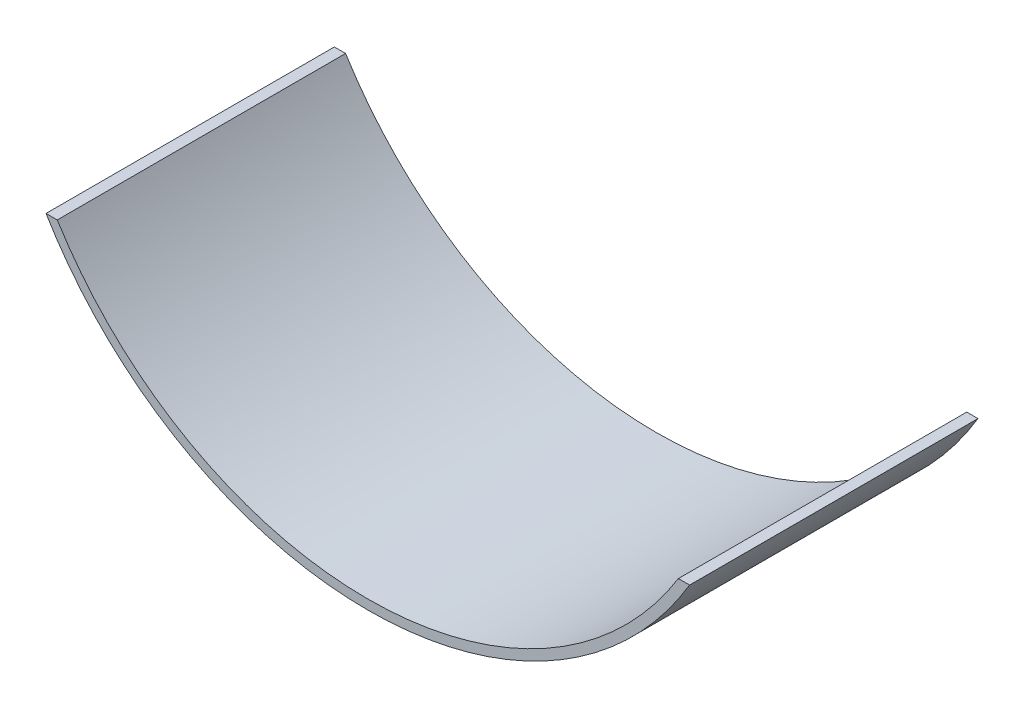
ISO-10303-21;
HEADER;
FILE_DESCRIPTION(('STEP AP214'),'2;1');
FILE_NAME('part.step','',(''),(''),'','','');
FILE_SCHEMA(('AUTOMOTIVE_DESIGN { 1 0 10303 214 1 1 1 1 }'));
ENDSEC;
DATA;
#1=APPLICATION_CONTEXT('core data for automotive mechanical design processes');
#2=APPLICATION_PROTOCOL_DEFINITION('international standard','automotive_design',2000,#1);
#3=PRODUCT_CONTEXT('',#1,'mechanical');
#4=PRODUCT('Part','Part','',(#3));
#5=PRODUCT_RELATED_PRODUCT_CATEGORY('part','',(#4));
#6=PRODUCT_DEFINITION_FORMATION('','',#4);
#7=PRODUCT_DEFINITION_CONTEXT('part definition',#1,'design');
#8=PRODUCT_DEFINITION('design','',#6,#7);
#9=PRODUCT_DEFINITION_SHAPE('','',#8);
#10=(LENGTH_UNIT() NAMED_UNIT(*) SI_UNIT(.MILLI.,.METRE.));
#11=(NAMED_UNIT(*) PLANE_ANGLE_UNIT() SI_UNIT($,.RADIAN.));
#12=(NAMED_UNIT(*) SI_UNIT($,.STERADIAN.) SOLID_ANGLE_UNIT());
#13=UNCERTAINTY_MEASURE_WITH_UNIT(LENGTH_MEASURE(1.E-05),#10,'distance_accuracy_value','');
#14=(GEOMETRIC_REPRESENTATION_CONTEXT(3) GLOBAL_UNCERTAINTY_ASSIGNED_CONTEXT((#13)) GLOBAL_UNIT_ASSIGNED_CONTEXT((#10,
#11,#12)) REPRESENTATION_CONTEXT('',''));
#15=CARTESIAN_POINT('',(0.,0.,0.));
#16=DIRECTION('',(0.,0.,1.));
#17=DIRECTION('',(1.,0.,0.));
#18=AXIS2_PLACEMENT_3D('',#15,#16,#17);
#19=CARTESIAN_POINT('',(0.,-100.,150.));
#20=DIRECTION('',(0.,1.,0.));
#21=DIRECTION('',(0.,0.,1.));
#22=AXIS2_PLACEMENT_3D('',#19,#20,#21);
#23=PLANE('',#22);
#24=DIRECTION('',(-1.,0.,0.));
#25=VECTOR('',#24,1.);
#26=CARTESIAN_POINT('',(167.406690427832,-100.,150.));
#27=LINE('',#26,#25);
#28=CARTESIAN_POINT('',(167.406690427832,-100.,150.));
#29=VERTEX_POINT('',#28);
#30=CARTESIAN_POINT('',(161.554944214035,-100.,150.));
#31=VERTEX_POINT('',#30);
#32=EDGE_CURVE('E83',#29,#31,#27,.T.);
#33=ORIENTED_EDGE('',*,*,#32,.F.);
#34=DIRECTION('',(0.,0.,-1.));
#35=VECTOR('',#34,1.);
#36=CARTESIAN_POINT('',(167.406690427832,-100.,150.));
#37=LINE('',#36,#35);
#38=CARTESIAN_POINT('',(167.406690427832,-100.,0.));
#39=VERTEX_POINT('',#38);
#40=EDGE_CURVE('E92',#29,#39,#37,.T.);
#41=ORIENTED_EDGE('',*,*,#40,.T.);
#42=DIRECTION('',(1.,0.,0.));
#43=VECTOR('',#42,1.);
#44=CARTESIAN_POINT('',(167.406690427832,-100.,0.));
#45=LINE('',#44,#43);
#46=CARTESIAN_POINT('',(161.554944214035,-100.,0.));
#47=VERTEX_POINT('',#46);
#48=EDGE_CURVE('E89',#47,#39,#45,.T.);
#49=ORIENTED_EDGE('',*,*,#48,.F.);
#50=DIRECTION('',(0.,0.,-1.));
#51=VECTOR('',#50,1.);
#52=CARTESIAN_POINT('',(161.554944214035,-100.,150.));
#53=LINE('',#52,#51);
#54=EDGE_CURVE('E94',#31,#47,#53,.T.);
#55=ORIENTED_EDGE('',*,*,#54,.F.);
#56=EDGE_LOOP('',(#33,#41,#49,#55));
#57=FACE_BOUND('',#56,.T.);
#58=ADVANCED_FACE('F40',(#57),#23,.T.);
#59=CARTESIAN_POINT('',(0.,0.,150.));
#60=DIRECTION('',(0.,0.,-1.));
#61=DIRECTION('',(-1.,0.,0.));
#62=AXIS2_PLACEMENT_3D('',#59,#60,#61);
#63=CYLINDRICAL_SURFACE('',#62,190.);
#64=CARTESIAN_POINT('',(0.,0.,0.));
#65=DIRECTION('',(0.,0.,1.));
#66=DIRECTION('',(1.,0.,0.));
#67=AXIS2_PLACEMENT_3D('',#64,#65,#66);
#68=CIRCLE('',#67,190.);
#69=CARTESIAN_POINT('',(-161.554944214035,-100.,0.));
#70=VERTEX_POINT('',#69);
#71=EDGE_CURVE('E55',#70,#47,#68,.T.);
#72=ORIENTED_EDGE('',*,*,#71,.F.);
#73=DIRECTION('',(0.,0.,-1.));
#74=VECTOR('',#73,1.);
#75=CARTESIAN_POINT('',(-161.554944214035,-100.,150.));
#76=LINE('',#75,#74);
#77=CARTESIAN_POINT('',(-161.554944214035,-100.,150.));
#78=VERTEX_POINT('',#77);
#79=EDGE_CURVE('E11',#78,#70,#76,.T.);
#80=ORIENTED_EDGE('',*,*,#79,.F.);
#81=CARTESIAN_POINT('',(0.,0.,150.));
#82=DIRECTION('',(0.,0.,1.));
#83=DIRECTION('',(1.,0.,0.));
#84=AXIS2_PLACEMENT_3D('',#81,#82,#83);
#85=CIRCLE('',#84,190.);
#86=EDGE_CURVE('E63',#78,#31,#85,.T.);
#87=ORIENTED_EDGE('',*,*,#86,.T.);
#88=ORIENTED_EDGE('',*,*,#54,.T.);
#89=EDGE_LOOP('',(#72,#80,#87,#88));
#90=FACE_BOUND('',#89,.T.);
#91=ADVANCED_FACE('F42',(#90),#63,.F.);
#92=CARTESIAN_POINT('',(0.,0.,150.));
#93=DIRECTION('',(0.,0.,-1.));
#94=DIRECTION('',(-1.,0.,0.));
#95=AXIS2_PLACEMENT_3D('',#92,#93,#94);
#96=CYLINDRICAL_SURFACE('',#95,195.);
#97=ORIENTED_EDGE('',*,*,#40,.F.);
#98=CARTESIAN_POINT('',(0.,0.,150.));
#99=DIRECTION('',(0.,0.,-1.));
#100=DIRECTION('',(-1.,0.,0.));
#101=AXIS2_PLACEMENT_3D('',#98,#99,#100);
#102=CIRCLE('',#101,195.);
#103=CARTESIAN_POINT('',(-167.406690427832,-100.,150.));
#104=VERTEX_POINT('',#103);
#105=EDGE_CURVE('E80',#29,#104,#102,.T.);
#106=ORIENTED_EDGE('',*,*,#105,.T.);
#107=DIRECTION('',(0.,0.,-1.));
#108=VECTOR('',#107,1.);
#109=CARTESIAN_POINT('',(-167.406690427832,-100.,150.));
#110=LINE('',#109,#108);
#111=CARTESIAN_POINT('',(-167.406690427832,-100.,0.));
#112=VERTEX_POINT('',#111);
#113=EDGE_CURVE('E48',#104,#112,#110,.T.);
#114=ORIENTED_EDGE('',*,*,#113,.T.);
#115=CARTESIAN_POINT('',(0.,0.,0.));
#116=DIRECTION('',(0.,0.,1.));
#117=DIRECTION('',(1.,0.,0.));
#118=AXIS2_PLACEMENT_3D('',#115,#116,#117);
#119=CIRCLE('',#118,195.);
#120=EDGE_CURVE('E99',#112,#39,#119,.T.);
#121=ORIENTED_EDGE('',*,*,#120,.T.);
#122=EDGE_LOOP('',(#97,#106,#114,#121));
#123=FACE_BOUND('',#122,.T.);
#124=ADVANCED_FACE('F97',(#123),#96,.T.);
#125=EDGE_CURVE('E85',#78,#104,#27,.T.);
#126=ORIENTED_EDGE('',*,*,#125,.F.);
#127=ORIENTED_EDGE('',*,*,#79,.T.);
#128=EDGE_CURVE('E106',#112,#70,#45,.T.);
#129=ORIENTED_EDGE('',*,*,#128,.F.);
#130=ORIENTED_EDGE('',*,*,#113,.F.);
#131=EDGE_LOOP('',(#126,#127,#129,#130));
#132=FACE_BOUND('',#131,.T.);
#133=ADVANCED_FACE('F112',(#132),#23,.T.);
#134=CARTESIAN_POINT('',(167.406690427832,-574.,0.));
#135=DIRECTION('',(0.,0.,1.));
#136=DIRECTION('',(1.,0.,0.));
#137=AXIS2_PLACEMENT_3D('',#134,#135,#136);
#138=PLANE('',#137);
#139=ORIENTED_EDGE('',*,*,#71,.T.);
#140=ORIENTED_EDGE('',*,*,#48,.T.);
#141=ORIENTED_EDGE('',*,*,#120,.F.);
#142=ORIENTED_EDGE('',*,*,#128,.T.);
#143=EDGE_LOOP('',(#139,#140,#141,#142));
#144=FACE_BOUND('',#143,.T.);
#145=ADVANCED_FACE('F108',(#144),#138,.F.);
#146=CARTESIAN_POINT('',(167.406690427832,-574.,150.));
#147=DIRECTION('',(0.,0.,-1.));
#148=DIRECTION('',(-1.,0.,0.));
#149=AXIS2_PLACEMENT_3D('',#146,#147,#148);
#150=PLANE('',#149);
#151=ORIENTED_EDGE('',*,*,#86,.F.);
#152=ORIENTED_EDGE('',*,*,#125,.T.);
#153=ORIENTED_EDGE('',*,*,#105,.F.);
#154=ORIENTED_EDGE('',*,*,#32,.T.);
#155=EDGE_LOOP('',(#151,#152,#153,#154));
#156=FACE_BOUND('',#155,.T.);
#157=ADVANCED_FACE('F82',(#156),#150,.F.);
#158=CLOSED_SHELL('',(#58,#91,#124,#133,#145,#157));
#159=MANIFOLD_SOLID_BREP('B2',#158);
#160=ADVANCED_BREP_SHAPE_REPRESENTATION('',(#18,#159),#14);
#161=SHAPE_DEFINITION_REPRESENTATION(#9,#160);
ENDSEC;
END-ISO-10303-21;
